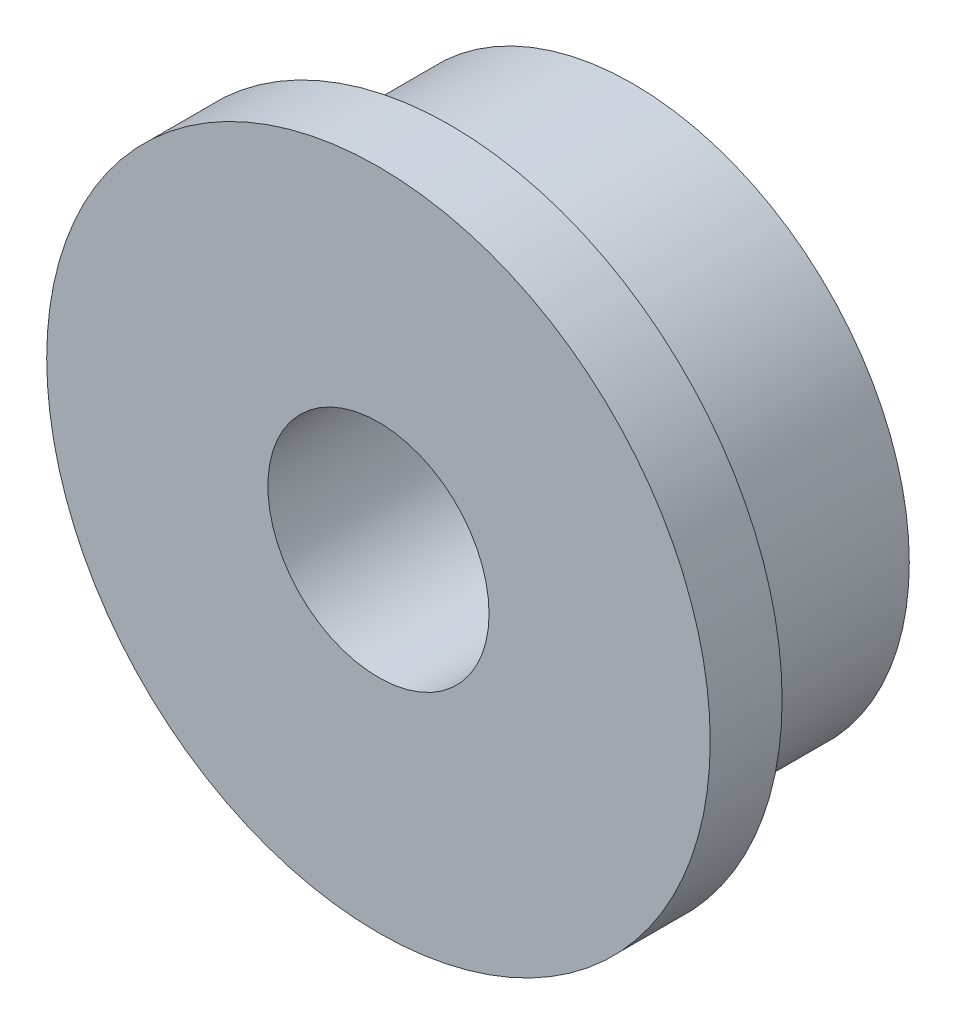
ISO-10303-21;
HEADER;
FILE_DESCRIPTION(('STEP AP214'),'2;1');
FILE_NAME('part.step','',(''),(''),'','','');
FILE_SCHEMA(('AUTOMOTIVE_DESIGN { 1 0 10303 214 1 1 1 1 }'));
ENDSEC;
DATA;
#1=APPLICATION_CONTEXT('core data for automotive mechanical design processes');
#2=APPLICATION_PROTOCOL_DEFINITION('international standard','automotive_design',2000,#1);
#3=PRODUCT_CONTEXT('',#1,'mechanical');
#4=PRODUCT('Part','Part','',(#3));
#5=PRODUCT_RELATED_PRODUCT_CATEGORY('part','',(#4));
#6=PRODUCT_DEFINITION_FORMATION('','',#4);
#7=PRODUCT_DEFINITION_CONTEXT('part definition',#1,'design');
#8=PRODUCT_DEFINITION('design','',#6,#7);
#9=PRODUCT_DEFINITION_SHAPE('','',#8);
#10=(LENGTH_UNIT() NAMED_UNIT(*) SI_UNIT(.MILLI.,.METRE.));
#11=(NAMED_UNIT(*) PLANE_ANGLE_UNIT() SI_UNIT($,.RADIAN.));
#12=(NAMED_UNIT(*) SI_UNIT($,.STERADIAN.) SOLID_ANGLE_UNIT());
#13=UNCERTAINTY_MEASURE_WITH_UNIT(LENGTH_MEASURE(1.E-05),#10,'distance_accuracy_value','');
#14=(GEOMETRIC_REPRESENTATION_CONTEXT(3) GLOBAL_UNCERTAINTY_ASSIGNED_CONTEXT((#13)) GLOBAL_UNIT_ASSIGNED_CONTEXT((#10,
#11,#12)) REPRESENTATION_CONTEXT('',''));
#15=CARTESIAN_POINT('',(0.,0.,0.));
#16=DIRECTION('',(0.,0.,1.));
#17=DIRECTION('',(1.,0.,0.));
#18=AXIS2_PLACEMENT_3D('',#15,#16,#17);
#19=CARTESIAN_POINT('',(0.,0.,0.));
#20=DIRECTION('',(0.,0.,1.));
#21=DIRECTION('',(1.,0.,0.));
#22=AXIS2_PLACEMENT_3D('',#19,#20,#21);
#23=PLANE('',#22);
#24=CARTESIAN_POINT('',(0.,0.,0.));
#25=DIRECTION('',(0.,0.,1.));
#26=DIRECTION('',(1.,0.,0.));
#27=AXIS2_PLACEMENT_3D('',#24,#25,#26);
#28=CIRCLE('',#27,2.5);
#29=CARTESIAN_POINT('',(2.5,0.,0.));
#30=VERTEX_POINT('',#29);
#31=EDGE_CURVE('E36',#30,#30,#28,.T.);
#32=ORIENTED_EDGE('',*,*,#31,.F.);
#33=EDGE_LOOP('',(#32));
#34=FACE_BOUND('',#33,.T.);
#35=CARTESIAN_POINT('',(0.,0.,0.));
#36=DIRECTION('',(0.,0.,1.));
#37=DIRECTION('',(1.,0.,0.));
#38=AXIS2_PLACEMENT_3D('',#35,#36,#37);
#39=CIRCLE('',#38,1.);
#40=CARTESIAN_POINT('',(1.,0.,0.));
#41=VERTEX_POINT('',#40);
#42=EDGE_CURVE('E43',#41,#41,#39,.T.);
#43=ORIENTED_EDGE('',*,*,#42,.T.);
#44=EDGE_LOOP('',(#43));
#45=FACE_BOUND('',#44,.T.);
#46=ADVANCED_FACE('F32',(#34,#45),#23,.F.);
#47=CARTESIAN_POINT('',(0.,0.,1.65));
#48=DIRECTION('',(0.,0.,-1.));
#49=DIRECTION('',(-1.,0.,0.));
#50=AXIS2_PLACEMENT_3D('',#47,#48,#49);
#51=CYLINDRICAL_SURFACE('',#50,2.5);
#52=CARTESIAN_POINT('',(0.,0.,1.65));
#53=DIRECTION('',(0.,0.,1.));
#54=DIRECTION('',(1.,0.,0.));
#55=AXIS2_PLACEMENT_3D('',#52,#53,#54);
#56=CIRCLE('',#55,2.5);
#57=CARTESIAN_POINT('',(2.5,0.,1.65));
#58=VERTEX_POINT('',#57);
#59=EDGE_CURVE('E10',#58,#58,#56,.T.);
#60=ORIENTED_EDGE('',*,*,#59,.F.);
#61=EDGE_LOOP('',(#60));
#62=FACE_BOUND('',#61,.T.);
#63=ORIENTED_EDGE('',*,*,#31,.T.);
#64=EDGE_LOOP('',(#63));
#65=FACE_BOUND('',#64,.T.);
#66=ADVANCED_FACE('F34',(#62,#65),#51,.T.);
#67=CARTESIAN_POINT('',(0.,0.,1.65));
#68=DIRECTION('',(0.,0.,-1.));
#69=DIRECTION('',(-1.,0.,0.));
#70=AXIS2_PLACEMENT_3D('',#67,#68,#69);
#71=CYLINDRICAL_SURFACE('',#70,1.);
#72=ORIENTED_EDGE('',*,*,#42,.F.);
#73=EDGE_LOOP('',(#72));
#74=FACE_BOUND('',#73,.T.);
#75=CARTESIAN_POINT('',(0.,0.,2.3));
#76=DIRECTION('',(0.,0.,1.));
#77=DIRECTION('',(1.,0.,0.));
#78=AXIS2_PLACEMENT_3D('',#75,#76,#77);
#79=CIRCLE('',#78,1.);
#80=CARTESIAN_POINT('',(1.,0.,2.3));
#81=VERTEX_POINT('',#80);
#82=EDGE_CURVE('E51',#81,#81,#79,.T.);
#83=ORIENTED_EDGE('',*,*,#82,.T.);
#84=EDGE_LOOP('',(#83));
#85=FACE_BOUND('',#84,.T.);
#86=ADVANCED_FACE('F57',(#74,#85),#71,.F.);
#87=CARTESIAN_POINT('',(0.,0.,2.3));
#88=DIRECTION('',(0.,0.,1.));
#89=DIRECTION('',(1.,0.,0.));
#90=AXIS2_PLACEMENT_3D('',#87,#88,#89);
#91=PLANE('',#90);
#92=CARTESIAN_POINT('',(0.,0.,2.3));
#93=DIRECTION('',(0.,0.,1.));
#94=DIRECTION('',(1.,0.,0.));
#95=AXIS2_PLACEMENT_3D('',#92,#93,#94);
#96=CIRCLE('',#95,3.);
#97=CARTESIAN_POINT('',(3.,0.,2.3));
#98=VERTEX_POINT('',#97);
#99=EDGE_CURVE('E47',#98,#98,#96,.T.);
#100=ORIENTED_EDGE('',*,*,#99,.T.);
#101=EDGE_LOOP('',(#100));
#102=FACE_BOUND('',#101,.T.);
#103=ORIENTED_EDGE('',*,*,#82,.F.);
#104=EDGE_LOOP('',(#103));
#105=FACE_BOUND('',#104,.T.);
#106=ADVANCED_FACE('F59',(#102,#105),#91,.T.);
#107=CARTESIAN_POINT('',(0.,0.,1.65));
#108=DIRECTION('',(0.,0.,1.));
#109=DIRECTION('',(1.,0.,0.));
#110=AXIS2_PLACEMENT_3D('',#107,#108,#109);
#111=PLANE('',#110);
#112=ORIENTED_EDGE('',*,*,#59,.T.);
#113=EDGE_LOOP('',(#112));
#114=FACE_BOUND('',#113,.T.);
#115=CARTESIAN_POINT('',(0.,0.,1.65));
#116=DIRECTION('',(0.,0.,1.));
#117=DIRECTION('',(1.,0.,0.));
#118=AXIS2_PLACEMENT_3D('',#115,#116,#117);
#119=CIRCLE('',#118,3.);
#120=CARTESIAN_POINT('',(3.,0.,1.65));
#121=VERTEX_POINT('',#120);
#122=EDGE_CURVE('E48',#121,#121,#119,.T.);
#123=ORIENTED_EDGE('',*,*,#122,.F.);
#124=EDGE_LOOP('',(#123));
#125=FACE_BOUND('',#124,.T.);
#126=ADVANCED_FACE('F61',(#114,#125),#111,.F.);
#127=CARTESIAN_POINT('',(0.,0.,2.3));
#128=DIRECTION('',(0.,0.,-1.));
#129=DIRECTION('',(-1.,0.,0.));
#130=AXIS2_PLACEMENT_3D('',#127,#128,#129);
#131=CYLINDRICAL_SURFACE('',#130,3.);
#132=ORIENTED_EDGE('',*,*,#99,.F.);
#133=EDGE_LOOP('',(#132));
#134=FACE_BOUND('',#133,.T.);
#135=ORIENTED_EDGE('',*,*,#122,.T.);
#136=EDGE_LOOP('',(#135));
#137=FACE_BOUND('',#136,.T.);
#138=ADVANCED_FACE('F68',(#134,#137),#131,.T.);
#139=CLOSED_SHELL('',(#46,#66,#86,#106,#126,#138));
#140=MANIFOLD_SOLID_BREP('B2',#139);
#141=ADVANCED_BREP_SHAPE_REPRESENTATION('',(#18,#140),#14);
#142=SHAPE_DEFINITION_REPRESENTATION(#9,#141);
ENDSEC;
END-ISO-10303-21;
